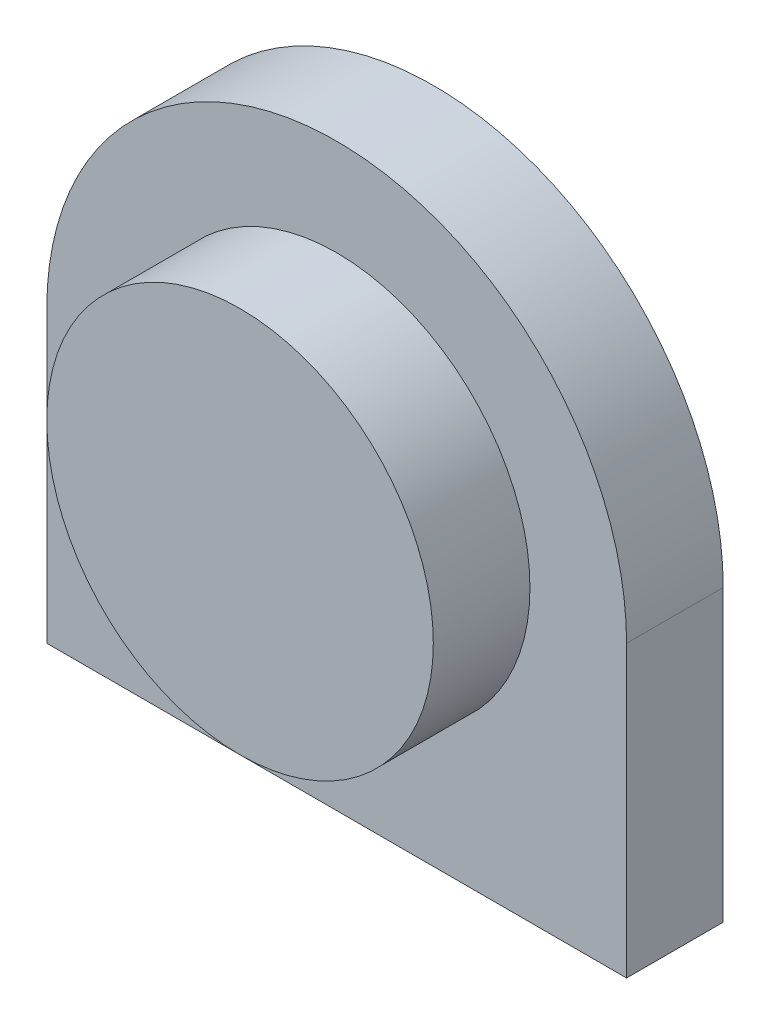
ISO-10303-21;
HEADER;
FILE_DESCRIPTION(('STEP AP214'),'2;1');
FILE_NAME('part.step','',(''),(''),'','','');
FILE_SCHEMA(('AUTOMOTIVE_DESIGN { 1 0 10303 214 1 1 1 1 }'));
ENDSEC;
DATA;
#1=APPLICATION_CONTEXT('core data for automotive mechanical design processes');
#2=APPLICATION_PROTOCOL_DEFINITION('international standard','automotive_design',2000,#1);
#3=PRODUCT_CONTEXT('',#1,'mechanical');
#4=PRODUCT('Part','Part','',(#3));
#5=PRODUCT_RELATED_PRODUCT_CATEGORY('part','',(#4));
#6=PRODUCT_DEFINITION_FORMATION('','',#4);
#7=PRODUCT_DEFINITION_CONTEXT('part definition',#1,'design');
#8=PRODUCT_DEFINITION('design','',#6,#7);
#9=PRODUCT_DEFINITION_SHAPE('','',#8);
#10=(LENGTH_UNIT() NAMED_UNIT(*) SI_UNIT(.MILLI.,.METRE.));
#11=(NAMED_UNIT(*) PLANE_ANGLE_UNIT() SI_UNIT($,.RADIAN.));
#12=(NAMED_UNIT(*) SI_UNIT($,.STERADIAN.) SOLID_ANGLE_UNIT());
#13=UNCERTAINTY_MEASURE_WITH_UNIT(LENGTH_MEASURE(1.E-05),#10,'distance_accuracy_value','');
#14=(GEOMETRIC_REPRESENTATION_CONTEXT(3) GLOBAL_UNCERTAINTY_ASSIGNED_CONTEXT((#13)) GLOBAL_UNIT_ASSIGNED_CONTEXT((#10,
#11,#12)) REPRESENTATION_CONTEXT('',''));
#15=CARTESIAN_POINT('',(0.,0.,0.));
#16=DIRECTION('',(0.,0.,1.));
#17=DIRECTION('',(1.,0.,0.));
#18=AXIS2_PLACEMENT_3D('',#15,#16,#17);
#19=CARTESIAN_POINT('',(0.,0.,10.));
#20=DIRECTION('',(0.,0.,-1.));
#21=DIRECTION('',(-1.,0.,0.));
#22=AXIS2_PLACEMENT_3D('',#19,#20,#21);
#23=CYLINDRICAL_SURFACE('',#22,30.);
#24=CARTESIAN_POINT('',(0.,0.,0.));
#25=DIRECTION('',(0.,0.,1.));
#26=DIRECTION('',(1.,0.,0.));
#27=AXIS2_PLACEMENT_3D('',#24,#25,#26);
#28=CIRCLE('',#27,30.);
#29=CARTESIAN_POINT('',(30.,0.,0.));
#30=VERTEX_POINT('',#29);
#31=CARTESIAN_POINT('',(-30.,0.,0.));
#32=VERTEX_POINT('',#31);
#33=EDGE_CURVE('E110',#30,#32,#28,.T.);
#34=ORIENTED_EDGE('',*,*,#33,.T.);
#35=DIRECTION('',(0.,0.,-1.));
#36=VECTOR('',#35,1.);
#37=CARTESIAN_POINT('',(-30.,0.,10.));
#38=LINE('',#37,#36);
#39=CARTESIAN_POINT('',(-30.,0.,10.));
#40=VERTEX_POINT('',#39);
#41=EDGE_CURVE('E42',#40,#32,#38,.T.);
#42=ORIENTED_EDGE('',*,*,#41,.F.);
#43=CARTESIAN_POINT('',(0.,0.,10.));
#44=DIRECTION('',(0.,0.,1.));
#45=DIRECTION('',(1.,0.,0.));
#46=AXIS2_PLACEMENT_3D('',#43,#44,#45);
#47=CIRCLE('',#46,30.);
#48=CARTESIAN_POINT('',(30.,0.,10.));
#49=VERTEX_POINT('',#48);
#50=EDGE_CURVE('E93',#49,#40,#47,.T.);
#51=ORIENTED_EDGE('',*,*,#50,.F.);
#52=DIRECTION('',(0.,0.,-1.));
#53=VECTOR('',#52,1.);
#54=CARTESIAN_POINT('',(30.,0.,10.));
#55=LINE('',#54,#53);
#56=EDGE_CURVE('E106',#49,#30,#55,.T.);
#57=ORIENTED_EDGE('',*,*,#56,.T.);
#58=EDGE_LOOP('',(#34,#42,#51,#57));
#59=FACE_BOUND('',#58,.T.);
#60=ADVANCED_FACE('F39',(#59),#23,.T.);
#61=CARTESIAN_POINT('',(-30.,0.,10.));
#62=DIRECTION('',(1.,0.,0.));
#63=DIRECTION('',(0.,0.,-1.));
#64=AXIS2_PLACEMENT_3D('',#61,#62,#63);
#65=PLANE('',#64);
#66=DIRECTION('',(0.,-1.,0.));
#67=VECTOR('',#66,1.);
#68=CARTESIAN_POINT('',(-30.,0.,0.));
#69=LINE('',#68,#67);
#70=CARTESIAN_POINT('',(-30.,-30.,0.));
#71=VERTEX_POINT('',#70);
#72=EDGE_CURVE('E99',#32,#71,#69,.T.);
#73=ORIENTED_EDGE('',*,*,#72,.T.);
#74=DIRECTION('',(0.,0.,-1.));
#75=VECTOR('',#74,1.);
#76=CARTESIAN_POINT('',(-30.,-30.,10.));
#77=LINE('',#76,#75);
#78=CARTESIAN_POINT('',(-30.,-30.,10.));
#79=VERTEX_POINT('',#78);
#80=EDGE_CURVE('E97',#79,#71,#77,.T.);
#81=ORIENTED_EDGE('',*,*,#80,.F.);
#82=DIRECTION('',(0.,-1.,0.));
#83=VECTOR('',#82,1.);
#84=CARTESIAN_POINT('',(-30.,0.,10.));
#85=LINE('',#84,#83);
#86=EDGE_CURVE('E88',#40,#79,#85,.T.);
#87=ORIENTED_EDGE('',*,*,#86,.F.);
#88=ORIENTED_EDGE('',*,*,#41,.T.);
#89=EDGE_LOOP('',(#73,#81,#87,#88));
#90=FACE_BOUND('',#89,.T.);
#91=ADVANCED_FACE('F98',(#90),#65,.F.);
#92=CARTESIAN_POINT('',(-30.,-30.,10.));
#93=DIRECTION('',(0.,1.,0.));
#94=DIRECTION('',(0.,0.,1.));
#95=AXIS2_PLACEMENT_3D('',#92,#93,#94);
#96=PLANE('',#95);
#97=DIRECTION('',(1.,0.,0.));
#98=VECTOR('',#97,1.);
#99=CARTESIAN_POINT('',(-30.,-30.,0.));
#100=LINE('',#99,#98);
#101=CARTESIAN_POINT('',(30.,-30.,0.));
#102=VERTEX_POINT('',#101);
#103=EDGE_CURVE('E74',#71,#102,#100,.T.);
#104=ORIENTED_EDGE('',*,*,#103,.T.);
#105=DIRECTION('',(0.,0.,-1.));
#106=VECTOR('',#105,1.);
#107=CARTESIAN_POINT('',(30.,-30.,10.));
#108=LINE('',#107,#106);
#109=CARTESIAN_POINT('',(30.,-30.,10.));
#110=VERTEX_POINT('',#109);
#111=EDGE_CURVE('E101',#110,#102,#108,.T.);
#112=ORIENTED_EDGE('',*,*,#111,.F.);
#113=DIRECTION('',(1.,0.,0.));
#114=VECTOR('',#113,1.);
#115=CARTESIAN_POINT('',(-30.,-30.,10.));
#116=LINE('',#115,#114);
#117=EDGE_CURVE('E91',#79,#110,#116,.T.);
#118=ORIENTED_EDGE('',*,*,#117,.F.);
#119=ORIENTED_EDGE('',*,*,#80,.T.);
#120=EDGE_LOOP('',(#104,#112,#118,#119));
#121=FACE_BOUND('',#120,.T.);
#122=ADVANCED_FACE('F102',(#121),#96,.F.);
#123=CARTESIAN_POINT('',(30.,0.,10.));
#124=DIRECTION('',(-1.,0.,0.));
#125=DIRECTION('',(0.,0.,1.));
#126=AXIS2_PLACEMENT_3D('',#123,#124,#125);
#127=PLANE('',#126);
#128=DIRECTION('',(0.,1.,0.));
#129=VECTOR('',#128,1.);
#130=CARTESIAN_POINT('',(30.,0.,0.));
#131=LINE('',#130,#129);
#132=EDGE_CURVE('E80',#102,#30,#131,.T.);
#133=ORIENTED_EDGE('',*,*,#132,.T.);
#134=ORIENTED_EDGE('',*,*,#56,.F.);
#135=DIRECTION('',(0.,1.,0.));
#136=VECTOR('',#135,1.);
#137=CARTESIAN_POINT('',(30.,0.,10.));
#138=LINE('',#137,#136);
#139=EDGE_CURVE('E57',#110,#49,#138,.T.);
#140=ORIENTED_EDGE('',*,*,#139,.F.);
#141=ORIENTED_EDGE('',*,*,#111,.T.);
#142=EDGE_LOOP('',(#133,#134,#140,#141));
#143=FACE_BOUND('',#142,.T.);
#144=ADVANCED_FACE('F124',(#143),#127,.F.);
#145=CARTESIAN_POINT('',(0.,0.,10.));
#146=DIRECTION('',(0.,0.,1.));
#147=DIRECTION('',(1.,0.,0.));
#148=AXIS2_PLACEMENT_3D('',#145,#146,#147);
#149=PLANE('',#148);
#150=CARTESIAN_POINT('',(0.,0.,10.));
#151=DIRECTION('',(0.,0.,1.));
#152=DIRECTION('',(1.,0.,0.));
#153=AXIS2_PLACEMENT_3D('',#150,#151,#152);
#154=CIRCLE('',#153,20.);
#155=CARTESIAN_POINT('',(20.,0.,10.));
#156=VERTEX_POINT('',#155);
#157=EDGE_CURVE('E11',#156,#156,#154,.T.);
#158=ORIENTED_EDGE('',*,*,#157,.F.);
#159=EDGE_LOOP('',(#158));
#160=FACE_BOUND('',#159,.T.);
#161=ORIENTED_EDGE('',*,*,#50,.T.);
#162=ORIENTED_EDGE('',*,*,#86,.T.);
#163=ORIENTED_EDGE('',*,*,#117,.T.);
#164=ORIENTED_EDGE('',*,*,#139,.T.);
#165=EDGE_LOOP('',(#161,#162,#163,#164));
#166=FACE_BOUND('',#165,.T.);
#167=ADVANCED_FACE('F89',(#160,#166),#149,.T.);
#168=CARTESIAN_POINT('',(0.,0.,0.));
#169=DIRECTION('',(0.,0.,1.));
#170=DIRECTION('',(1.,0.,0.));
#171=AXIS2_PLACEMENT_3D('',#168,#169,#170);
#172=PLANE('',#171);
#173=ORIENTED_EDGE('',*,*,#33,.F.);
#174=ORIENTED_EDGE('',*,*,#132,.F.);
#175=ORIENTED_EDGE('',*,*,#103,.F.);
#176=ORIENTED_EDGE('',*,*,#72,.F.);
#177=EDGE_LOOP('',(#173,#174,#175,#176));
#178=FACE_BOUND('',#177,.T.);
#179=ADVANCED_FACE('F127',(#178),#172,.F.);
#180=CARTESIAN_POINT('',(0.,0.,20.));
#181=DIRECTION('',(0.,0.,-1.));
#182=DIRECTION('',(-1.,0.,0.));
#183=AXIS2_PLACEMENT_3D('',#180,#181,#182);
#184=CYLINDRICAL_SURFACE('',#183,20.);
#185=CARTESIAN_POINT('',(0.,0.,20.));
#186=DIRECTION('',(0.,0.,1.));
#187=DIRECTION('',(1.,0.,0.));
#188=AXIS2_PLACEMENT_3D('',#185,#186,#187);
#189=CIRCLE('',#188,20.);
#190=CARTESIAN_POINT('',(20.,0.,20.));
#191=VERTEX_POINT('',#190);
#192=EDGE_CURVE('E114',#191,#191,#189,.T.);
#193=ORIENTED_EDGE('',*,*,#192,.F.);
#194=EDGE_LOOP('',(#193));
#195=FACE_BOUND('',#194,.T.);
#196=ORIENTED_EDGE('',*,*,#157,.T.);
#197=EDGE_LOOP('',(#196));
#198=FACE_BOUND('',#197,.T.);
#199=ADVANCED_FACE('F137',(#195,#198),#184,.T.);
#200=CARTESIAN_POINT('',(0.,0.,20.));
#201=DIRECTION('',(0.,0.,1.));
#202=DIRECTION('',(1.,0.,0.));
#203=AXIS2_PLACEMENT_3D('',#200,#201,#202);
#204=PLANE('',#203);
#205=ORIENTED_EDGE('',*,*,#192,.T.);
#206=EDGE_LOOP('',(#205));
#207=FACE_BOUND('',#206,.T.);
#208=ADVANCED_FACE('F135',(#207),#204,.T.);
#209=CLOSED_SHELL('',(#60,#91,#122,#144,#167,#179,#199,#208));
#210=MANIFOLD_SOLID_BREP('B2',#209);
#211=ADVANCED_BREP_SHAPE_REPRESENTATION('',(#18,#210),#14);
#212=SHAPE_DEFINITION_REPRESENTATION(#9,#211);
ENDSEC;
END-ISO-10303-21;
